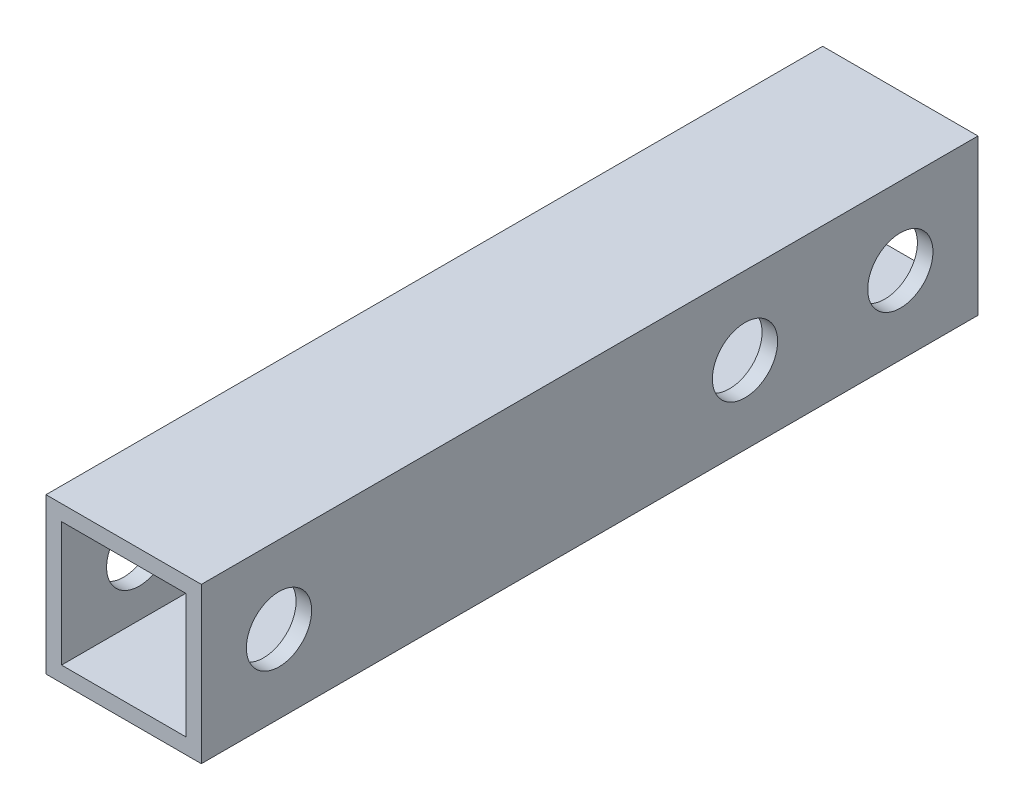
ISO-10303-21;
HEADER;
FILE_DESCRIPTION(('STEP AP214'),'2;1');
FILE_NAME('part.step','',(''),(''),'','','');
FILE_SCHEMA(('AUTOMOTIVE_DESIGN { 1 0 10303 214 1 1 1 1 }'));
ENDSEC;
DATA;
#1=APPLICATION_CONTEXT('core data for automotive mechanical design processes');
#2=APPLICATION_PROTOCOL_DEFINITION('international standard','automotive_design',2000,#1);
#3=PRODUCT_CONTEXT('',#1,'mechanical');
#4=PRODUCT('Part','Part','',(#3));
#5=PRODUCT_RELATED_PRODUCT_CATEGORY('part','',(#4));
#6=PRODUCT_DEFINITION_FORMATION('','',#4);
#7=PRODUCT_DEFINITION_CONTEXT('part definition',#1,'design');
#8=PRODUCT_DEFINITION('design','',#6,#7);
#9=PRODUCT_DEFINITION_SHAPE('','',#8);
#10=(LENGTH_UNIT() NAMED_UNIT(*) SI_UNIT(.MILLI.,.METRE.));
#11=(NAMED_UNIT(*) PLANE_ANGLE_UNIT() SI_UNIT($,.RADIAN.));
#12=(NAMED_UNIT(*) SI_UNIT($,.STERADIAN.) SOLID_ANGLE_UNIT());
#13=UNCERTAINTY_MEASURE_WITH_UNIT(LENGTH_MEASURE(1.E-05),#10,'distance_accuracy_value','');
#14=(GEOMETRIC_REPRESENTATION_CONTEXT(3) GLOBAL_UNCERTAINTY_ASSIGNED_CONTEXT((#13)) GLOBAL_UNIT_ASSIGNED_CONTEXT((#10,
#11,#12)) REPRESENTATION_CONTEXT('',''));
#15=CARTESIAN_POINT('',(0.,0.,0.));
#16=DIRECTION('',(0.,0.,1.));
#17=DIRECTION('',(1.,0.,0.));
#18=AXIS2_PLACEMENT_3D('',#15,#16,#17);
#19=CARTESIAN_POINT('',(0.,0.,50.));
#20=DIRECTION('',(0.,0.,1.));
#21=DIRECTION('',(1.,0.,0.));
#22=AXIS2_PLACEMENT_3D('',#19,#20,#21);
#23=PLANE('',#22);
#24=DIRECTION('',(0.,-1.,0.));
#25=VECTOR('',#24,1.);
#26=CARTESIAN_POINT('',(0.,0.,50.));
#27=LINE('',#26,#25);
#28=CARTESIAN_POINT('',(0.,10.,50.));
#29=VERTEX_POINT('',#28);
#30=CARTESIAN_POINT('',(0.,0.,50.));
#31=VERTEX_POINT('',#30);
#32=EDGE_CURVE('E164',#29,#31,#27,.T.);
#33=ORIENTED_EDGE('',*,*,#32,.T.);
#34=DIRECTION('',(1.,0.,0.));
#35=VECTOR('',#34,1.);
#36=CARTESIAN_POINT('',(0.,0.,50.));
#37=LINE('',#36,#35);
#38=CARTESIAN_POINT('',(10.,0.,50.));
#39=VERTEX_POINT('',#38);
#40=EDGE_CURVE('E167',#31,#39,#37,.T.);
#41=ORIENTED_EDGE('',*,*,#40,.T.);
#42=DIRECTION('',(0.,1.,0.));
#43=VECTOR('',#42,1.);
#44=CARTESIAN_POINT('',(10.,0.,50.));
#45=LINE('',#44,#43);
#46=CARTESIAN_POINT('',(10.,10.,50.));
#47=VERTEX_POINT('',#46);
#48=EDGE_CURVE('E170',#39,#47,#45,.T.);
#49=ORIENTED_EDGE('',*,*,#48,.T.);
#50=DIRECTION('',(-1.,0.,0.));
#51=VECTOR('',#50,1.);
#52=CARTESIAN_POINT('',(0.,10.,50.));
#53=LINE('',#52,#51);
#54=EDGE_CURVE('E172',#47,#29,#53,.T.);
#55=ORIENTED_EDGE('',*,*,#54,.T.);
#56=EDGE_LOOP('',(#33,#41,#49,#55));
#57=FACE_BOUND('',#56,.T.);
#58=DIRECTION('',(1.,0.,0.));
#59=VECTOR('',#58,1.);
#60=CARTESIAN_POINT('',(0.,1.,50.));
#61=LINE('',#60,#59);
#62=CARTESIAN_POINT('',(1.,1.,50.));
#63=VERTEX_POINT('',#62);
#64=CARTESIAN_POINT('',(9.,1.,50.));
#65=VERTEX_POINT('',#64);
#66=EDGE_CURVE('E134',#63,#65,#61,.T.);
#67=ORIENTED_EDGE('',*,*,#66,.F.);
#68=DIRECTION('',(0.,-1.,0.));
#69=VECTOR('',#68,1.);
#70=CARTESIAN_POINT('',(1.,0.,50.));
#71=LINE('',#70,#69);
#72=CARTESIAN_POINT('',(1.,9.,50.));
#73=VERTEX_POINT('',#72);
#74=EDGE_CURVE('E126',#73,#63,#71,.T.);
#75=ORIENTED_EDGE('',*,*,#74,.F.);
#76=DIRECTION('',(-1.,0.,0.));
#77=VECTOR('',#76,1.);
#78=CARTESIAN_POINT('',(0.,9.,50.));
#79=LINE('',#78,#77);
#80=CARTESIAN_POINT('',(9.,9.,50.));
#81=VERTEX_POINT('',#80);
#82=EDGE_CURVE('E148',#81,#73,#79,.T.);
#83=ORIENTED_EDGE('',*,*,#82,.F.);
#84=DIRECTION('',(0.,1.,0.));
#85=VECTOR('',#84,1.);
#86=CARTESIAN_POINT('',(9.,0.,50.));
#87=LINE('',#86,#85);
#88=EDGE_CURVE('E146',#65,#81,#87,.T.);
#89=ORIENTED_EDGE('',*,*,#88,.F.);
#90=EDGE_LOOP('',(#67,#75,#83,#89));
#91=FACE_BOUND('',#90,.T.);
#92=ADVANCED_FACE('F59',(#57,#91),#23,.T.);
#93=CARTESIAN_POINT('',(0.,0.,0.));
#94=DIRECTION('',(0.,0.,1.));
#95=DIRECTION('',(1.,0.,0.));
#96=AXIS2_PLACEMENT_3D('',#93,#94,#95);
#97=PLANE('',#96);
#98=DIRECTION('',(0.,-1.,0.));
#99=VECTOR('',#98,1.);
#100=CARTESIAN_POINT('',(0.,0.,0.));
#101=LINE('',#100,#99);
#102=CARTESIAN_POINT('',(0.,10.,0.));
#103=VERTEX_POINT('',#102);
#104=CARTESIAN_POINT('',(0.,0.,0.));
#105=VERTEX_POINT('',#104);
#106=EDGE_CURVE('E142',#103,#105,#101,.T.);
#107=ORIENTED_EDGE('',*,*,#106,.F.);
#108=DIRECTION('',(-1.,0.,0.));
#109=VECTOR('',#108,1.);
#110=CARTESIAN_POINT('',(0.,10.,0.));
#111=LINE('',#110,#109);
#112=CARTESIAN_POINT('',(10.,10.,0.));
#113=VERTEX_POINT('',#112);
#114=EDGE_CURVE('E168',#113,#103,#111,.T.);
#115=ORIENTED_EDGE('',*,*,#114,.F.);
#116=DIRECTION('',(0.,1.,0.));
#117=VECTOR('',#116,1.);
#118=CARTESIAN_POINT('',(10.,0.,0.));
#119=LINE('',#118,#117);
#120=CARTESIAN_POINT('',(10.,0.,0.));
#121=VERTEX_POINT('',#120);
#122=EDGE_CURVE('E179',#121,#113,#119,.T.);
#123=ORIENTED_EDGE('',*,*,#122,.F.);
#124=DIRECTION('',(1.,0.,0.));
#125=VECTOR('',#124,1.);
#126=CARTESIAN_POINT('',(0.,0.,0.));
#127=LINE('',#126,#125);
#128=EDGE_CURVE('E177',#105,#121,#127,.T.);
#129=ORIENTED_EDGE('',*,*,#128,.F.);
#130=EDGE_LOOP('',(#107,#115,#123,#129));
#131=FACE_BOUND('',#130,.T.);
#132=DIRECTION('',(0.,-1.,0.));
#133=VECTOR('',#132,1.);
#134=CARTESIAN_POINT('',(1.,0.,0.));
#135=LINE('',#134,#133);
#136=CARTESIAN_POINT('',(1.,9.,0.));
#137=VERTEX_POINT('',#136);
#138=CARTESIAN_POINT('',(1.,1.,0.));
#139=VERTEX_POINT('',#138);
#140=EDGE_CURVE('E84',#137,#139,#135,.T.);
#141=ORIENTED_EDGE('',*,*,#140,.T.);
#142=DIRECTION('',(1.,0.,0.));
#143=VECTOR('',#142,1.);
#144=CARTESIAN_POINT('',(0.,1.,0.));
#145=LINE('',#144,#143);
#146=CARTESIAN_POINT('',(9.,1.,0.));
#147=VERTEX_POINT('',#146);
#148=EDGE_CURVE('E141',#139,#147,#145,.T.);
#149=ORIENTED_EDGE('',*,*,#148,.T.);
#150=DIRECTION('',(0.,1.,0.));
#151=VECTOR('',#150,1.);
#152=CARTESIAN_POINT('',(9.,0.,0.));
#153=LINE('',#152,#151);
#154=CARTESIAN_POINT('',(9.,9.,0.));
#155=VERTEX_POINT('',#154);
#156=EDGE_CURVE('E156',#147,#155,#153,.T.);
#157=ORIENTED_EDGE('',*,*,#156,.T.);
#158=DIRECTION('',(-1.,0.,0.));
#159=VECTOR('',#158,1.);
#160=CARTESIAN_POINT('',(0.,9.,0.));
#161=LINE('',#160,#159);
#162=EDGE_CURVE('E135',#155,#137,#161,.T.);
#163=ORIENTED_EDGE('',*,*,#162,.T.);
#164=EDGE_LOOP('',(#141,#149,#157,#163));
#165=FACE_BOUND('',#164,.T.);
#166=ADVANCED_FACE('F226',(#131,#165),#97,.F.);
#167=CARTESIAN_POINT('',(0.,0.,50.));
#168=DIRECTION('',(1.,0.,0.));
#169=DIRECTION('',(0.,0.,-1.));
#170=AXIS2_PLACEMENT_3D('',#167,#168,#169);
#171=PLANE('',#170);
#172=CARTESIAN_POINT('',(0.,5.,5.));
#173=DIRECTION('',(1.,0.,0.));
#174=DIRECTION('',(0.,0.,-1.));
#175=AXIS2_PLACEMENT_3D('',#172,#173,#174);
#176=CIRCLE('',#175,2.1);
#177=CARTESIAN_POINT('',(0.,5.,2.9));
#178=VERTEX_POINT('',#177);
#179=EDGE_CURVE('E192',#178,#178,#176,.F.);
#180=ORIENTED_EDGE('',*,*,#179,.F.);
#181=EDGE_LOOP('',(#180));
#182=FACE_BOUND('',#181,.T.);
#183=CARTESIAN_POINT('',(0.,5.,15.));
#184=DIRECTION('',(1.,0.,0.));
#185=DIRECTION('',(0.,0.,-1.));
#186=AXIS2_PLACEMENT_3D('',#183,#184,#185);
#187=CIRCLE('',#186,2.1);
#188=CARTESIAN_POINT('',(0.,5.,12.9));
#189=VERTEX_POINT('',#188);
#190=EDGE_CURVE('E282',#189,#189,#187,.F.);
#191=ORIENTED_EDGE('',*,*,#190,.F.);
#192=EDGE_LOOP('',(#191));
#193=FACE_BOUND('',#192,.T.);
#194=CARTESIAN_POINT('',(0.,4.99999999999999,45.));
#195=DIRECTION('',(1.,0.,0.));
#196=DIRECTION('',(0.,0.,-1.));
#197=AXIS2_PLACEMENT_3D('',#194,#195,#196);
#198=CIRCLE('',#197,2.1);
#199=CARTESIAN_POINT('',(0.,4.99999999999999,42.9));
#200=VERTEX_POINT('',#199);
#201=EDGE_CURVE('E205',#200,#200,#198,.F.);
#202=ORIENTED_EDGE('',*,*,#201,.F.);
#203=EDGE_LOOP('',(#202));
#204=FACE_BOUND('',#203,.T.);
#205=ORIENTED_EDGE('',*,*,#106,.T.);
#206=DIRECTION('',(0.,0.,-1.));
#207=VECTOR('',#206,1.);
#208=CARTESIAN_POINT('',(0.,0.,50.));
#209=LINE('',#208,#207);
#210=EDGE_CURVE('E12',#31,#105,#209,.T.);
#211=ORIENTED_EDGE('',*,*,#210,.F.);
#212=ORIENTED_EDGE('',*,*,#32,.F.);
#213=DIRECTION('',(0.,0.,-1.));
#214=VECTOR('',#213,1.);
#215=CARTESIAN_POINT('',(0.,10.,50.));
#216=LINE('',#215,#214);
#217=EDGE_CURVE('E174',#29,#103,#216,.T.);
#218=ORIENTED_EDGE('',*,*,#217,.T.);
#219=EDGE_LOOP('',(#205,#211,#212,#218));
#220=FACE_BOUND('',#219,.T.);
#221=ADVANCED_FACE('F61',(#182,#193,#204,#220),#171,.F.);
#222=CARTESIAN_POINT('',(0.,0.,50.));
#223=DIRECTION('',(0.,1.,0.));
#224=DIRECTION('',(0.,0.,1.));
#225=AXIS2_PLACEMENT_3D('',#222,#223,#224);
#226=PLANE('',#225);
#227=ORIENTED_EDGE('',*,*,#128,.T.);
#228=DIRECTION('',(0.,0.,-1.));
#229=VECTOR('',#228,1.);
#230=CARTESIAN_POINT('',(10.,0.,50.));
#231=LINE('',#230,#229);
#232=EDGE_CURVE('E68',#39,#121,#231,.T.);
#233=ORIENTED_EDGE('',*,*,#232,.F.);
#234=ORIENTED_EDGE('',*,*,#40,.F.);
#235=ORIENTED_EDGE('',*,*,#210,.T.);
#236=EDGE_LOOP('',(#227,#233,#234,#235));
#237=FACE_BOUND('',#236,.T.);
#238=ADVANCED_FACE('F254',(#237),#226,.F.);
#239=CARTESIAN_POINT('',(10.,0.,50.));
#240=DIRECTION('',(-1.,0.,0.));
#241=DIRECTION('',(0.,0.,1.));
#242=AXIS2_PLACEMENT_3D('',#239,#240,#241);
#243=PLANE('',#242);
#244=CARTESIAN_POINT('',(10.,5.,5.));
#245=DIRECTION('',(1.,0.,0.));
#246=DIRECTION('',(0.,0.,-1.));
#247=AXIS2_PLACEMENT_3D('',#244,#245,#246);
#248=CIRCLE('',#247,2.1);
#249=CARTESIAN_POINT('',(10.,5.,2.9));
#250=VERTEX_POINT('',#249);
#251=EDGE_CURVE('E294',#250,#250,#248,.T.);
#252=ORIENTED_EDGE('',*,*,#251,.F.);
#253=EDGE_LOOP('',(#252));
#254=FACE_BOUND('',#253,.T.);
#255=CARTESIAN_POINT('',(10.,5.,15.));
#256=DIRECTION('',(1.,0.,0.));
#257=DIRECTION('',(0.,0.,-1.));
#258=AXIS2_PLACEMENT_3D('',#255,#256,#257);
#259=CIRCLE('',#258,2.1);
#260=CARTESIAN_POINT('',(10.,5.,12.9));
#261=VERTEX_POINT('',#260);
#262=EDGE_CURVE('E286',#261,#261,#259,.T.);
#263=ORIENTED_EDGE('',*,*,#262,.F.);
#264=EDGE_LOOP('',(#263));
#265=FACE_BOUND('',#264,.T.);
#266=CARTESIAN_POINT('',(10.,4.99999999999999,45.));
#267=DIRECTION('',(1.,0.,0.));
#268=DIRECTION('',(0.,0.,-1.));
#269=AXIS2_PLACEMENT_3D('',#266,#267,#268);
#270=CIRCLE('',#269,2.1);
#271=CARTESIAN_POINT('',(10.,4.99999999999999,42.9));
#272=VERTEX_POINT('',#271);
#273=EDGE_CURVE('E287',#272,#272,#270,.T.);
#274=ORIENTED_EDGE('',*,*,#273,.F.);
#275=EDGE_LOOP('',(#274));
#276=FACE_BOUND('',#275,.T.);
#277=ORIENTED_EDGE('',*,*,#122,.T.);
#278=DIRECTION('',(0.,0.,-1.));
#279=VECTOR('',#278,1.);
#280=CARTESIAN_POINT('',(10.,10.,50.));
#281=LINE('',#280,#279);
#282=EDGE_CURVE('E184',#47,#113,#281,.T.);
#283=ORIENTED_EDGE('',*,*,#282,.F.);
#284=ORIENTED_EDGE('',*,*,#48,.F.);
#285=ORIENTED_EDGE('',*,*,#232,.T.);
#286=EDGE_LOOP('',(#277,#283,#284,#285));
#287=FACE_BOUND('',#286,.T.);
#288=ADVANCED_FACE('F251',(#254,#265,#276,#287),#243,.F.);
#289=CARTESIAN_POINT('',(0.,10.,50.));
#290=DIRECTION('',(0.,-1.,0.));
#291=DIRECTION('',(0.,0.,-1.));
#292=AXIS2_PLACEMENT_3D('',#289,#290,#291);
#293=PLANE('',#292);
#294=ORIENTED_EDGE('',*,*,#114,.T.);
#295=ORIENTED_EDGE('',*,*,#217,.F.);
#296=ORIENTED_EDGE('',*,*,#54,.F.);
#297=ORIENTED_EDGE('',*,*,#282,.T.);
#298=EDGE_LOOP('',(#294,#295,#296,#297));
#299=FACE_BOUND('',#298,.T.);
#300=ADVANCED_FACE('F248',(#299),#293,.F.);
#301=CARTESIAN_POINT('',(1.,0.,50.));
#302=DIRECTION('',(1.,0.,0.));
#303=DIRECTION('',(0.,0.,-1.));
#304=AXIS2_PLACEMENT_3D('',#301,#302,#303);
#305=PLANE('',#304);
#306=CARTESIAN_POINT('',(1.,5.,5.));
#307=DIRECTION('',(1.,0.,0.));
#308=DIRECTION('',(0.,0.,-1.));
#309=AXIS2_PLACEMENT_3D('',#306,#307,#308);
#310=CIRCLE('',#309,2.1);
#311=CARTESIAN_POINT('',(1.,5.,2.9));
#312=VERTEX_POINT('',#311);
#313=EDGE_CURVE('E154',#312,#312,#310,.T.);
#314=ORIENTED_EDGE('',*,*,#313,.F.);
#315=EDGE_LOOP('',(#314));
#316=FACE_BOUND('',#315,.T.);
#317=CARTESIAN_POINT('',(1.,5.,15.));
#318=DIRECTION('',(1.,0.,0.));
#319=DIRECTION('',(0.,0.,-1.));
#320=AXIS2_PLACEMENT_3D('',#317,#318,#319);
#321=CIRCLE('',#320,2.1);
#322=CARTESIAN_POINT('',(1.,5.,12.9));
#323=VERTEX_POINT('',#322);
#324=EDGE_CURVE('E195',#323,#323,#321,.T.);
#325=ORIENTED_EDGE('',*,*,#324,.F.);
#326=EDGE_LOOP('',(#325));
#327=FACE_BOUND('',#326,.T.);
#328=CARTESIAN_POINT('',(1.,4.99999999999999,45.));
#329=DIRECTION('',(1.,0.,0.));
#330=DIRECTION('',(0.,0.,-1.));
#331=AXIS2_PLACEMENT_3D('',#328,#329,#330);
#332=CIRCLE('',#331,2.1);
#333=CARTESIAN_POINT('',(1.,4.99999999999999,42.9));
#334=VERTEX_POINT('',#333);
#335=EDGE_CURVE('E191',#334,#334,#332,.T.);
#336=ORIENTED_EDGE('',*,*,#335,.F.);
#337=EDGE_LOOP('',(#336));
#338=FACE_BOUND('',#337,.T.);
#339=ORIENTED_EDGE('',*,*,#140,.F.);
#340=DIRECTION('',(0.,0.,-1.));
#341=VECTOR('',#340,1.);
#342=CARTESIAN_POINT('',(1.,9.,50.));
#343=LINE('',#342,#341);
#344=EDGE_CURVE('E130',#73,#137,#343,.T.);
#345=ORIENTED_EDGE('',*,*,#344,.F.);
#346=ORIENTED_EDGE('',*,*,#74,.T.);
#347=DIRECTION('',(0.,0.,-1.));
#348=VECTOR('',#347,1.);
#349=CARTESIAN_POINT('',(1.,1.,50.));
#350=LINE('',#349,#348);
#351=EDGE_CURVE('E129',#63,#139,#350,.T.);
#352=ORIENTED_EDGE('',*,*,#351,.T.);
#353=EDGE_LOOP('',(#339,#345,#346,#352));
#354=FACE_BOUND('',#353,.T.);
#355=ADVANCED_FACE('F128',(#316,#327,#338,#354),#305,.T.);
#356=CARTESIAN_POINT('',(0.,1.,50.));
#357=DIRECTION('',(0.,1.,0.));
#358=DIRECTION('',(0.,0.,1.));
#359=AXIS2_PLACEMENT_3D('',#356,#357,#358);
#360=PLANE('',#359);
#361=ORIENTED_EDGE('',*,*,#148,.F.);
#362=ORIENTED_EDGE('',*,*,#351,.F.);
#363=ORIENTED_EDGE('',*,*,#66,.T.);
#364=DIRECTION('',(0.,0.,-1.));
#365=VECTOR('',#364,1.);
#366=CARTESIAN_POINT('',(9.,1.,50.));
#367=LINE('',#366,#365);
#368=EDGE_CURVE('E143',#65,#147,#367,.T.);
#369=ORIENTED_EDGE('',*,*,#368,.T.);
#370=EDGE_LOOP('',(#361,#362,#363,#369));
#371=FACE_BOUND('',#370,.T.);
#372=ADVANCED_FACE('F138',(#371),#360,.T.);
#373=CARTESIAN_POINT('',(9.,0.,50.));
#374=DIRECTION('',(-1.,0.,0.));
#375=DIRECTION('',(0.,0.,1.));
#376=AXIS2_PLACEMENT_3D('',#373,#374,#375);
#377=PLANE('',#376);
#378=CARTESIAN_POINT('',(9.,5.,5.));
#379=DIRECTION('',(-1.,0.,0.));
#380=DIRECTION('',(0.,0.,1.));
#381=AXIS2_PLACEMENT_3D('',#378,#379,#380);
#382=CIRCLE('',#381,2.1);
#383=CARTESIAN_POINT('',(9.,5.,7.1));
#384=VERTEX_POINT('',#383);
#385=EDGE_CURVE('E63',#384,#384,#382,.T.);
#386=ORIENTED_EDGE('',*,*,#385,.F.);
#387=EDGE_LOOP('',(#386));
#388=FACE_BOUND('',#387,.T.);
#389=CARTESIAN_POINT('',(9.,5.,15.));
#390=DIRECTION('',(-1.,0.,0.));
#391=DIRECTION('',(0.,0.,1.));
#392=AXIS2_PLACEMENT_3D('',#389,#390,#391);
#393=CIRCLE('',#392,2.1);
#394=CARTESIAN_POINT('',(9.,5.,17.1));
#395=VERTEX_POINT('',#394);
#396=EDGE_CURVE('E193',#395,#395,#393,.T.);
#397=ORIENTED_EDGE('',*,*,#396,.F.);
#398=EDGE_LOOP('',(#397));
#399=FACE_BOUND('',#398,.T.);
#400=CARTESIAN_POINT('',(9.,4.99999999999999,45.));
#401=DIRECTION('',(-1.,0.,0.));
#402=DIRECTION('',(0.,0.,1.));
#403=AXIS2_PLACEMENT_3D('',#400,#401,#402);
#404=CIRCLE('',#403,2.1);
#405=CARTESIAN_POINT('',(9.,4.99999999999999,47.1));
#406=VERTEX_POINT('',#405);
#407=EDGE_CURVE('E189',#406,#406,#404,.T.);
#408=ORIENTED_EDGE('',*,*,#407,.F.);
#409=EDGE_LOOP('',(#408));
#410=FACE_BOUND('',#409,.T.);
#411=ORIENTED_EDGE('',*,*,#156,.F.);
#412=ORIENTED_EDGE('',*,*,#368,.F.);
#413=ORIENTED_EDGE('',*,*,#88,.T.);
#414=DIRECTION('',(0.,0.,-1.));
#415=VECTOR('',#414,1.);
#416=CARTESIAN_POINT('',(9.,9.,50.));
#417=LINE('',#416,#415);
#418=EDGE_CURVE('E76',#81,#155,#417,.T.);
#419=ORIENTED_EDGE('',*,*,#418,.T.);
#420=EDGE_LOOP('',(#411,#412,#413,#419));
#421=FACE_BOUND('',#420,.T.);
#422=ADVANCED_FACE('F216',(#388,#399,#410,#421),#377,.T.);
#423=CARTESIAN_POINT('',(0.,9.,50.));
#424=DIRECTION('',(0.,-1.,0.));
#425=DIRECTION('',(0.,0.,-1.));
#426=AXIS2_PLACEMENT_3D('',#423,#424,#425);
#427=PLANE('',#426);
#428=ORIENTED_EDGE('',*,*,#162,.F.);
#429=ORIENTED_EDGE('',*,*,#418,.F.);
#430=ORIENTED_EDGE('',*,*,#82,.T.);
#431=ORIENTED_EDGE('',*,*,#344,.T.);
#432=EDGE_LOOP('',(#428,#429,#430,#431));
#433=FACE_BOUND('',#432,.T.);
#434=ADVANCED_FACE('F219',(#433),#427,.T.);
#435=CARTESIAN_POINT('',(-5.93969696196701,4.99999999999999,45.));
#436=DIRECTION('',(1.,0.,0.));
#437=DIRECTION('',(0.,0.,-1.));
#438=AXIS2_PLACEMENT_3D('',#435,#436,#437);
#439=CYLINDRICAL_SURFACE('',#438,2.1);
#440=ORIENTED_EDGE('',*,*,#407,.T.);
#441=EDGE_LOOP('',(#440));
#442=FACE_BOUND('',#441,.T.);
#443=ORIENTED_EDGE('',*,*,#273,.T.);
#444=EDGE_LOOP('',(#443));
#445=FACE_BOUND('',#444,.T.);
#446=ADVANCED_FACE('F228',(#442,#445),#439,.F.);
#447=CARTESIAN_POINT('',(-5.93969696196701,5.,15.));
#448=DIRECTION('',(1.,0.,0.));
#449=DIRECTION('',(0.,0.,-1.));
#450=AXIS2_PLACEMENT_3D('',#447,#448,#449);
#451=CYLINDRICAL_SURFACE('',#450,2.1);
#452=ORIENTED_EDGE('',*,*,#396,.T.);
#453=EDGE_LOOP('',(#452));
#454=FACE_BOUND('',#453,.T.);
#455=ORIENTED_EDGE('',*,*,#262,.T.);
#456=EDGE_LOOP('',(#455));
#457=FACE_BOUND('',#456,.T.);
#458=ADVANCED_FACE('F233',(#454,#457),#451,.F.);
#459=CARTESIAN_POINT('',(-5.93969696196701,5.,5.));
#460=DIRECTION('',(1.,0.,0.));
#461=DIRECTION('',(0.,0.,-1.));
#462=AXIS2_PLACEMENT_3D('',#459,#460,#461);
#463=CYLINDRICAL_SURFACE('',#462,2.1);
#464=ORIENTED_EDGE('',*,*,#385,.T.);
#465=EDGE_LOOP('',(#464));
#466=FACE_BOUND('',#465,.T.);
#467=ORIENTED_EDGE('',*,*,#251,.T.);
#468=EDGE_LOOP('',(#467));
#469=FACE_BOUND('',#468,.T.);
#470=ADVANCED_FACE('F213',(#466,#469),#463,.F.);
#471=ORIENTED_EDGE('',*,*,#335,.T.);
#472=EDGE_LOOP('',(#471));
#473=FACE_BOUND('',#472,.T.);
#474=ORIENTED_EDGE('',*,*,#201,.T.);
#475=EDGE_LOOP('',(#474));
#476=FACE_BOUND('',#475,.T.);
#477=ADVANCED_FACE('F236',(#473,#476),#439,.F.);
#478=ORIENTED_EDGE('',*,*,#324,.T.);
#479=EDGE_LOOP('',(#478));
#480=FACE_BOUND('',#479,.T.);
#481=ORIENTED_EDGE('',*,*,#190,.T.);
#482=EDGE_LOOP('',(#481));
#483=FACE_BOUND('',#482,.T.);
#484=ADVANCED_FACE('F305',(#480,#483),#451,.F.);
#485=ORIENTED_EDGE('',*,*,#313,.T.);
#486=EDGE_LOOP('',(#485));
#487=FACE_BOUND('',#486,.T.);
#488=ORIENTED_EDGE('',*,*,#179,.T.);
#489=EDGE_LOOP('',(#488));
#490=FACE_BOUND('',#489,.T.);
#491=ADVANCED_FACE('F310',(#487,#490),#463,.F.);
#492=CLOSED_SHELL('',(#92,#166,#221,#238,#288,#300,#355,#372,#422,#434,#446,#458,#470,#477,#484,#491));
#493=MANIFOLD_SOLID_BREP('B2',#492);
#494=ADVANCED_BREP_SHAPE_REPRESENTATION('',(#18,#493),#14);
#495=SHAPE_DEFINITION_REPRESENTATION(#9,#494);
ENDSEC;
END-ISO-10303-21;
